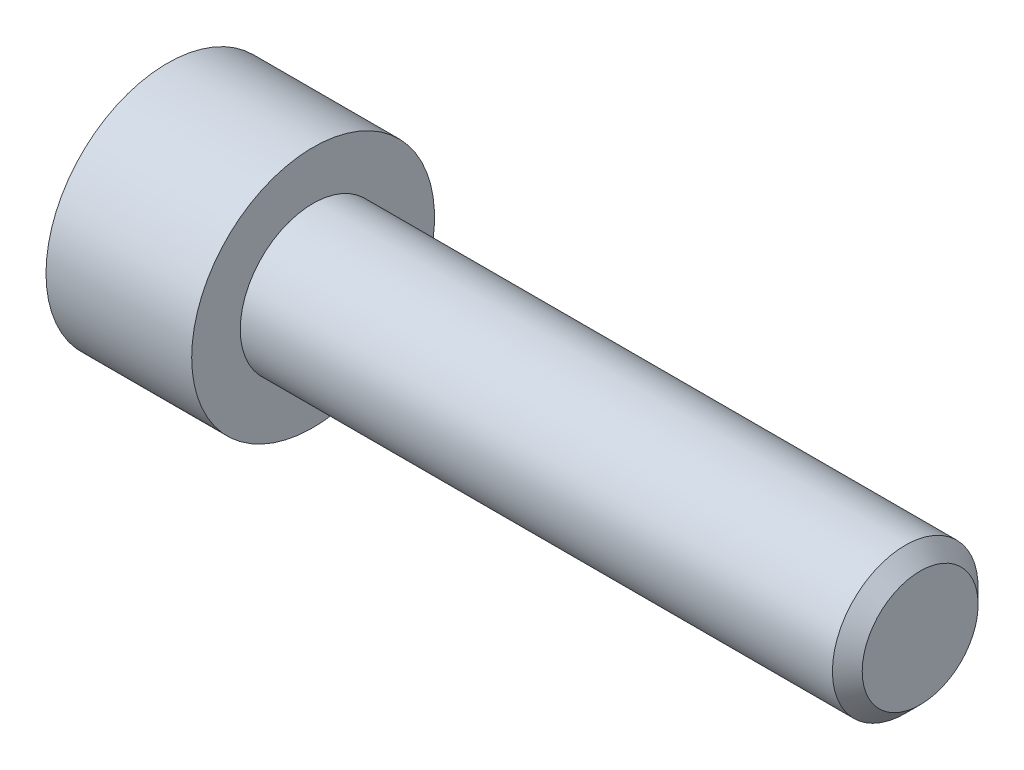
ISO-10303-21;
HEADER;
FILE_DESCRIPTION(('STEP AP214'),'2;1');
FILE_NAME('part.step','',(''),(''),'','','');
FILE_SCHEMA(('AUTOMOTIVE_DESIGN { 1 0 10303 214 1 1 1 1 }'));
ENDSEC;
DATA;
#1=APPLICATION_CONTEXT('core data for automotive mechanical design processes');
#2=APPLICATION_PROTOCOL_DEFINITION('international standard','automotive_design',2000,#1);
#3=PRODUCT_CONTEXT('',#1,'mechanical');
#4=PRODUCT('Part','Part','',(#3));
#5=PRODUCT_RELATED_PRODUCT_CATEGORY('part','',(#4));
#6=PRODUCT_DEFINITION_FORMATION('','',#4);
#7=PRODUCT_DEFINITION_CONTEXT('part definition',#1,'design');
#8=PRODUCT_DEFINITION('design','',#6,#7);
#9=PRODUCT_DEFINITION_SHAPE('','',#8);
#10=(LENGTH_UNIT() NAMED_UNIT(*) SI_UNIT(.MILLI.,.METRE.));
#11=(NAMED_UNIT(*) PLANE_ANGLE_UNIT() SI_UNIT($,.RADIAN.));
#12=(NAMED_UNIT(*) SI_UNIT($,.STERADIAN.) SOLID_ANGLE_UNIT());
#13=UNCERTAINTY_MEASURE_WITH_UNIT(LENGTH_MEASURE(1.E-05),#10,'distance_accuracy_value','');
#14=(GEOMETRIC_REPRESENTATION_CONTEXT(3) GLOBAL_UNCERTAINTY_ASSIGNED_CONTEXT((#13)) GLOBAL_UNIT_ASSIGNED_CONTEXT((#10,
#11,#12)) REPRESENTATION_CONTEXT('',''));
#15=CARTESIAN_POINT('',(0.,0.,0.));
#16=DIRECTION('',(0.,0.,1.));
#17=DIRECTION('',(1.,0.,0.));
#18=AXIS2_PLACEMENT_3D('',#15,#16,#17);
#19=CARTESIAN_POINT('',(4.,0.,0.));
#20=DIRECTION('',(1.,0.,0.));
#21=DIRECTION('',(0.,0.,-1.));
#22=AXIS2_PLACEMENT_3D('',#19,#20,#21);
#23=PLANE('',#22);
#24=DIRECTION('',(0.,1.,0.));
#25=VECTOR('',#24,1.);
#26=CARTESIAN_POINT('',(4.,0.,-2.5));
#27=LINE('',#26,#25);
#28=CARTESIAN_POINT('',(4.,-1.44337567297406,-2.5));
#29=VERTEX_POINT('',#28);
#30=CARTESIAN_POINT('',(3.99999999998113,0.,-2.49999999999886));
#31=VERTEX_POINT('',#30);
#32=EDGE_CURVE('E86',#29,#31,#27,.T.);
#33=ORIENTED_EDGE('',*,*,#32,.F.);
#34=DIRECTION('',(0.,0.500000000000004,-0.866025403784436));
#35=VECTOR('',#34,1.);
#36=CARTESIAN_POINT('',(4.,-2.1650635094611,-1.25));
#37=LINE('',#36,#35);
#38=CARTESIAN_POINT('',(3.99999999998113,-2.16506350946011,-1.24999999999943));
#39=VERTEX_POINT('',#38);
#40=EDGE_CURVE('E108',#39,#29,#37,.T.);
#41=ORIENTED_EDGE('',*,*,#40,.F.);
#42=CARTESIAN_POINT('',(3.99999999996226,0.,0.));
#43=DIRECTION('',(-1.,0.,0.));
#44=DIRECTION('',(0.,0.,1.));
#45=AXIS2_PLACEMENT_3D('',#42,#43,#44);
#46=CIRCLE('',#45,2.49999999999773);
#47=EDGE_CURVE('E19',#39,#31,#46,.F.);
#48=ORIENTED_EDGE('',*,*,#47,.T.);
#49=EDGE_LOOP('',(#33,#41,#48));
#50=FACE_BOUND('',#49,.T.);
#51=ADVANCED_FACE('F16',(#50),#23,.F.);
#52=CARTESIAN_POINT('',(4.,0.,0.));
#53=DIRECTION('',(1.,0.,0.));
#54=DIRECTION('',(0.,0.,-1.));
#55=AXIS2_PLACEMENT_3D('',#52,#53,#54);
#56=PLANE('',#55);
#57=DIRECTION('',(0.,0.500000000000004,0.866025403784436));
#58=VECTOR('',#57,1.);
#59=CARTESIAN_POINT('',(4.,1.44337567297406,-2.5));
#60=LINE('',#59,#58);
#61=CARTESIAN_POINT('',(4.,1.44337567297406,-2.5));
#62=VERTEX_POINT('',#61);
#63=CARTESIAN_POINT('',(3.99999999998113,2.16506350946011,-1.24999999999943));
#64=VERTEX_POINT('',#63);
#65=EDGE_CURVE('E128',#62,#64,#60,.T.);
#66=ORIENTED_EDGE('',*,*,#65,.F.);
#67=DIRECTION('',(0.,1.,0.));
#68=VECTOR('',#67,1.);
#69=CARTESIAN_POINT('',(4.,0.,-2.5));
#70=LINE('',#69,#68);
#71=EDGE_CURVE('E140',#31,#62,#70,.T.);
#72=ORIENTED_EDGE('',*,*,#71,.F.);
#73=CARTESIAN_POINT('',(3.99999999996226,0.,0.));
#74=DIRECTION('',(-1.,0.,0.));
#75=DIRECTION('',(0.,0.,1.));
#76=AXIS2_PLACEMENT_3D('',#73,#74,#75);
#77=CIRCLE('',#76,2.49999999999773);
#78=EDGE_CURVE('E119',#31,#64,#77,.F.);
#79=ORIENTED_EDGE('',*,*,#78,.T.);
#80=EDGE_LOOP('',(#66,#72,#79));
#81=FACE_BOUND('',#80,.T.);
#82=ADVANCED_FACE('F406',(#81),#56,.F.);
#83=CARTESIAN_POINT('',(4.,0.,0.));
#84=DIRECTION('',(1.,0.,0.));
#85=DIRECTION('',(0.,0.,-1.));
#86=AXIS2_PLACEMENT_3D('',#83,#84,#85);
#87=PLANE('',#86);
#88=DIRECTION('',(0.,-0.500000000000004,-0.866025403784436));
#89=VECTOR('',#88,1.);
#90=CARTESIAN_POINT('',(4.,-1.44337567297406,2.5));
#91=LINE('',#90,#89);
#92=CARTESIAN_POINT('',(4.,-1.44337567297406,2.5));
#93=VERTEX_POINT('',#92);
#94=CARTESIAN_POINT('',(3.99999999998113,-2.16506350946011,1.24999999999943));
#95=VERTEX_POINT('',#94);
#96=EDGE_CURVE('E120',#93,#95,#91,.T.);
#97=ORIENTED_EDGE('',*,*,#96,.F.);
#98=DIRECTION('',(0.,1.,0.));
#99=VECTOR('',#98,1.);
#100=CARTESIAN_POINT('',(4.,0.,2.5));
#101=LINE('',#100,#99);
#102=CARTESIAN_POINT('',(3.99999999998113,0.,2.49999999999886));
#103=VERTEX_POINT('',#102);
#104=EDGE_CURVE('E122',#103,#93,#101,.F.);
#105=ORIENTED_EDGE('',*,*,#104,.F.);
#106=CARTESIAN_POINT('',(3.99999999996226,0.,0.));
#107=DIRECTION('',(-1.,0.,0.));
#108=DIRECTION('',(0.,0.,1.));
#109=AXIS2_PLACEMENT_3D('',#106,#107,#108);
#110=CIRCLE('',#109,2.49999999999773);
#111=EDGE_CURVE('E102',#103,#95,#110,.F.);
#112=ORIENTED_EDGE('',*,*,#111,.T.);
#113=EDGE_LOOP('',(#97,#105,#112));
#114=FACE_BOUND('',#113,.T.);
#115=ADVANCED_FACE('F397',(#114),#87,.F.);
#116=CARTESIAN_POINT('',(3.99999999996226,0.,0.));
#117=DIRECTION('',(-1.,0.,0.));
#118=DIRECTION('',(0.,0.,1.));
#119=AXIS2_PLACEMENT_3D('',#116,#117,#118);
#120=CONICAL_SURFACE('',#119,2.49999999999773,1.0471975511585);
#121=CARTESIAN_POINT('',(3.99999999996226,0.,0.));
#122=DIRECTION('',(-1.,0.,0.));
#123=DIRECTION('',(0.,0.,1.));
#124=AXIS2_PLACEMENT_3D('',#121,#122,#123);
#125=CIRCLE('',#124,2.49999999999773);
#126=CARTESIAN_POINT('',(3.99999999998113,2.16506350946011,1.24999999999943));
#127=VERTEX_POINT('',#126);
#128=EDGE_CURVE('E121',#64,#127,#125,.F.);
#129=ORIENTED_EDGE('',*,*,#128,.F.);
#130=ORIENTED_EDGE('',*,*,#78,.F.);
#131=ORIENTED_EDGE('',*,*,#47,.F.);
#132=CARTESIAN_POINT('',(3.99999999996226,0.,0.));
#133=DIRECTION('',(-1.,0.,0.));
#134=DIRECTION('',(0.,0.,1.));
#135=AXIS2_PLACEMENT_3D('',#132,#133,#134);
#136=CIRCLE('',#135,2.49999999999773);
#137=EDGE_CURVE('E92',#95,#39,#136,.F.);
#138=ORIENTED_EDGE('',*,*,#137,.F.);
#139=ORIENTED_EDGE('',*,*,#111,.F.);
#140=CARTESIAN_POINT('',(3.99999999996226,0.,0.));
#141=DIRECTION('',(-1.,0.,0.));
#142=DIRECTION('',(0.,0.,1.));
#143=AXIS2_PLACEMENT_3D('',#140,#141,#142);
#144=CIRCLE('',#143,2.49999999999773);
#145=EDGE_CURVE('E101',#103,#127,#144,.T.);
#146=ORIENTED_EDGE('',*,*,#145,.T.);
#147=EDGE_LOOP('',(#129,#130,#131,#138,#139,#146));
#148=FACE_BOUND('',#147,.T.);
#149=CARTESIAN_POINT('',(5.44337567291109,5.6843418860808E-11,0.));
#150=VERTEX_POINT('',#149);
#151=VERTEX_LOOP('',#150);
#152=FACE_BOUND('',#151,.T.);
#153=ADVANCED_FACE('F116',(#148,#152),#120,.F.);
#154=CARTESIAN_POINT('',(4.,0.,0.));
#155=DIRECTION('',(1.,0.,0.));
#156=DIRECTION('',(0.,0.,-1.));
#157=AXIS2_PLACEMENT_3D('',#154,#155,#156);
#158=PLANE('',#157);
#159=DIRECTION('',(0.,1.,0.));
#160=VECTOR('',#159,1.);
#161=CARTESIAN_POINT('',(4.,-1.44337567297406,2.5));
#162=LINE('',#161,#160);
#163=CARTESIAN_POINT('',(4.,1.44337567297406,2.5));
#164=VERTEX_POINT('',#163);
#165=EDGE_CURVE('E192',#103,#164,#162,.T.);
#166=ORIENTED_EDGE('',*,*,#165,.T.);
#167=DIRECTION('',(0.,-0.5,0.866025403784439));
#168=VECTOR('',#167,1.);
#169=CARTESIAN_POINT('',(4.,1.44337567297406,2.5));
#170=LINE('',#169,#168);
#171=EDGE_CURVE('E190',#164,#127,#170,.F.);
#172=ORIENTED_EDGE('',*,*,#171,.T.);
#173=ORIENTED_EDGE('',*,*,#145,.F.);
#174=EDGE_LOOP('',(#166,#172,#173));
#175=FACE_BOUND('',#174,.T.);
#176=ADVANCED_FACE('F191',(#175),#158,.F.);
#177=CARTESIAN_POINT('',(4.,0.,0.));
#178=DIRECTION('',(1.,0.,0.));
#179=DIRECTION('',(0.,0.,-1.));
#180=AXIS2_PLACEMENT_3D('',#177,#178,#179);
#181=PLANE('',#180);
#182=ORIENTED_EDGE('',*,*,#137,.T.);
#183=DIRECTION('',(0.,0.5,-0.866025403784439));
#184=VECTOR('',#183,1.);
#185=CARTESIAN_POINT('',(4.,-1.44337567297406,-2.5));
#186=LINE('',#185,#184);
#187=CARTESIAN_POINT('',(4.,-2.88675134594813,0.));
#188=VERTEX_POINT('',#187);
#189=EDGE_CURVE('E95',#39,#188,#186,.F.);
#190=ORIENTED_EDGE('',*,*,#189,.T.);
#191=DIRECTION('',(0.,-0.5,-0.866025403784439));
#192=VECTOR('',#191,1.);
#193=CARTESIAN_POINT('',(4.,-2.88675134594813,0.));
#194=LINE('',#193,#192);
#195=EDGE_CURVE('E97',#188,#95,#194,.F.);
#196=ORIENTED_EDGE('',*,*,#195,.T.);
#197=EDGE_LOOP('',(#182,#190,#196));
#198=FACE_BOUND('',#197,.T.);
#199=ADVANCED_FACE('F94',(#198),#181,.F.);
#200=CARTESIAN_POINT('',(4.,0.,0.));
#201=DIRECTION('',(1.,0.,0.));
#202=DIRECTION('',(0.,0.,-1.));
#203=AXIS2_PLACEMENT_3D('',#200,#201,#202);
#204=PLANE('',#203);
#205=ORIENTED_EDGE('',*,*,#128,.T.);
#206=DIRECTION('',(0.,-0.5,0.866025403784439));
#207=VECTOR('',#206,1.);
#208=CARTESIAN_POINT('',(4.,1.44337567297406,2.5));
#209=LINE('',#208,#207);
#210=CARTESIAN_POINT('',(4.,2.88675134594813,0.));
#211=VERTEX_POINT('',#210);
#212=EDGE_CURVE('E175',#127,#211,#209,.F.);
#213=ORIENTED_EDGE('',*,*,#212,.T.);
#214=DIRECTION('',(0.,0.5,0.866025403784439));
#215=VECTOR('',#214,1.);
#216=CARTESIAN_POINT('',(4.,2.88675134594813,0.));
#217=LINE('',#216,#215);
#218=EDGE_CURVE('E184',#211,#64,#217,.F.);
#219=ORIENTED_EDGE('',*,*,#218,.T.);
#220=EDGE_LOOP('',(#205,#213,#219));
#221=FACE_BOUND('',#220,.T.);
#222=ADVANCED_FACE('F180',(#221),#204,.F.);
#223=CARTESIAN_POINT('',(0.,1.44337567297406,2.5));
#224=DIRECTION('',(0.,0.866025403784439,0.5));
#225=DIRECTION('',(0.,-0.5,0.866025403784439));
#226=AXIS2_PLACEMENT_3D('',#223,#224,#225);
#227=PLANE('',#226);
#228=DIRECTION('',(1.,0.,0.));
#229=VECTOR('',#228,1.);
#230=CARTESIAN_POINT('',(0.,1.44337567297406,2.5));
#231=LINE('',#230,#229);
#232=CARTESIAN_POINT('',(0.,1.44337567297406,2.5));
#233=VERTEX_POINT('',#232);
#234=EDGE_CURVE('E153',#164,#233,#231,.F.);
#235=ORIENTED_EDGE('',*,*,#234,.T.);
#236=DIRECTION('',(0.,-0.500000000000001,0.866025403784438));
#237=VECTOR('',#236,1.);
#238=CARTESIAN_POINT('',(0.,2.88675134594813,0.));
#239=LINE('',#238,#237);
#240=CARTESIAN_POINT('',(0.,2.88675134594813,0.));
#241=VERTEX_POINT('',#240);
#242=EDGE_CURVE('E205',#241,#233,#239,.T.);
#243=ORIENTED_EDGE('',*,*,#242,.F.);
#244=DIRECTION('',(1.,0.,0.));
#245=VECTOR('',#244,1.);
#246=CARTESIAN_POINT('',(0.,2.88675134594813,0.));
#247=LINE('',#246,#245);
#248=EDGE_CURVE('E157',#241,#211,#247,.T.);
#249=ORIENTED_EDGE('',*,*,#248,.T.);
#250=ORIENTED_EDGE('',*,*,#212,.F.);
#251=ORIENTED_EDGE('',*,*,#171,.F.);
#252=EDGE_LOOP('',(#235,#243,#249,#250,#251));
#253=FACE_BOUND('',#252,.T.);
#254=ADVANCED_FACE('F196',(#253),#227,.F.);
#255=CARTESIAN_POINT('',(0.,-1.44337567297406,2.5));
#256=DIRECTION('',(0.,0.,1.));
#257=DIRECTION('',(1.,0.,0.));
#258=AXIS2_PLACEMENT_3D('',#255,#256,#257);
#259=PLANE('',#258);
#260=DIRECTION('',(1.,0.,0.));
#261=VECTOR('',#260,1.);
#262=CARTESIAN_POINT('',(0.,-1.44337567297406,2.5));
#263=LINE('',#262,#261);
#264=CARTESIAN_POINT('',(0.,-1.44337567297406,2.5));
#265=VERTEX_POINT('',#264);
#266=EDGE_CURVE('E151',#93,#265,#263,.F.);
#267=ORIENTED_EDGE('',*,*,#266,.T.);
#268=DIRECTION('',(0.,1.,0.));
#269=VECTOR('',#268,1.);
#270=CARTESIAN_POINT('',(0.,2.5,2.5));
#271=LINE('',#270,#269);
#272=EDGE_CURVE('E208',#233,#265,#271,.F.);
#273=ORIENTED_EDGE('',*,*,#272,.F.);
#274=ORIENTED_EDGE('',*,*,#234,.F.);
#275=ORIENTED_EDGE('',*,*,#165,.F.);
#276=ORIENTED_EDGE('',*,*,#104,.T.);
#277=EDGE_LOOP('',(#267,#273,#274,#275,#276));
#278=FACE_BOUND('',#277,.T.);
#279=ADVANCED_FACE('F231',(#278),#259,.F.);
#280=CARTESIAN_POINT('',(0.,-2.88675134594813,0.));
#281=DIRECTION('',(0.,-0.866025403784439,0.5));
#282=DIRECTION('',(0.,-0.5,-0.866025403784439));
#283=AXIS2_PLACEMENT_3D('',#280,#281,#282);
#284=PLANE('',#283);
#285=DIRECTION('',(1.,0.,0.));
#286=VECTOR('',#285,1.);
#287=CARTESIAN_POINT('',(0.,-2.88675134594813,0.));
#288=LINE('',#287,#286);
#289=CARTESIAN_POINT('',(0.,-2.88675134594813,0.));
#290=VERTEX_POINT('',#289);
#291=EDGE_CURVE('E110',#188,#290,#288,.F.);
#292=ORIENTED_EDGE('',*,*,#291,.T.);
#293=DIRECTION('',(0.,-0.500000000000001,-0.866025403784438));
#294=VECTOR('',#293,1.);
#295=CARTESIAN_POINT('',(0.,-1.44337567297406,2.5));
#296=LINE('',#295,#294);
#297=EDGE_CURVE('E235',#265,#290,#296,.T.);
#298=ORIENTED_EDGE('',*,*,#297,.F.);
#299=ORIENTED_EDGE('',*,*,#266,.F.);
#300=ORIENTED_EDGE('',*,*,#96,.T.);
#301=ORIENTED_EDGE('',*,*,#195,.F.);
#302=EDGE_LOOP('',(#292,#298,#299,#300,#301));
#303=FACE_BOUND('',#302,.T.);
#304=ADVANCED_FACE('F340',(#303),#284,.F.);
#305=CARTESIAN_POINT('',(0.,-1.44337567297406,-2.5));
#306=DIRECTION('',(0.,-0.866025403784439,-0.5));
#307=DIRECTION('',(0.,0.5,-0.866025403784439));
#308=AXIS2_PLACEMENT_3D('',#305,#306,#307);
#309=PLANE('',#308);
#310=DIRECTION('',(-1.,0.,0.));
#311=VECTOR('',#310,1.);
#312=CARTESIAN_POINT('',(0.,-1.44337567297406,-2.5));
#313=LINE('',#312,#311);
#314=CARTESIAN_POINT('',(0.,-1.44337567297406,-2.5));
#315=VERTEX_POINT('',#314);
#316=EDGE_CURVE('E158',#29,#315,#313,.T.);
#317=ORIENTED_EDGE('',*,*,#316,.T.);
#318=DIRECTION('',(0.,0.500000000000001,-0.866025403784438));
#319=VECTOR('',#318,1.);
#320=CARTESIAN_POINT('',(0.,-2.88675134594813,0.));
#321=LINE('',#320,#319);
#322=EDGE_CURVE('E249',#290,#315,#321,.T.);
#323=ORIENTED_EDGE('',*,*,#322,.F.);
#324=ORIENTED_EDGE('',*,*,#291,.F.);
#325=ORIENTED_EDGE('',*,*,#189,.F.);
#326=ORIENTED_EDGE('',*,*,#40,.T.);
#327=EDGE_LOOP('',(#317,#323,#324,#325,#326));
#328=FACE_BOUND('',#327,.T.);
#329=ADVANCED_FACE('F107',(#328),#309,.F.);
#330=CARTESIAN_POINT('',(0.,1.44337567297406,-2.5));
#331=DIRECTION('',(0.,0.,-1.));
#332=DIRECTION('',(-1.,0.,0.));
#333=AXIS2_PLACEMENT_3D('',#330,#331,#332);
#334=PLANE('',#333);
#335=DIRECTION('',(1.,0.,0.));
#336=VECTOR('',#335,1.);
#337=CARTESIAN_POINT('',(0.,1.44337567297406,-2.5));
#338=LINE('',#337,#336);
#339=CARTESIAN_POINT('',(0.,1.44337567297406,-2.5));
#340=VERTEX_POINT('',#339);
#341=EDGE_CURVE('E34',#62,#340,#338,.F.);
#342=ORIENTED_EDGE('',*,*,#341,.T.);
#343=DIRECTION('',(0.,1.,0.));
#344=VECTOR('',#343,1.);
#345=CARTESIAN_POINT('',(0.,2.5,-2.5));
#346=LINE('',#345,#344);
#347=EDGE_CURVE('E213',#315,#340,#346,.T.);
#348=ORIENTED_EDGE('',*,*,#347,.F.);
#349=ORIENTED_EDGE('',*,*,#316,.F.);
#350=ORIENTED_EDGE('',*,*,#32,.T.);
#351=ORIENTED_EDGE('',*,*,#71,.T.);
#352=EDGE_LOOP('',(#342,#348,#349,#350,#351));
#353=FACE_BOUND('',#352,.T.);
#354=ADVANCED_FACE('F323',(#353),#334,.F.);
#355=CARTESIAN_POINT('',(0.,2.88675134594813,0.));
#356=DIRECTION('',(0.,0.866025403784439,-0.5));
#357=DIRECTION('',(0.,0.5,0.866025403784439));
#358=AXIS2_PLACEMENT_3D('',#355,#356,#357);
#359=PLANE('',#358);
#360=ORIENTED_EDGE('',*,*,#248,.F.);
#361=DIRECTION('',(0.,0.500000000000001,0.866025403784438));
#362=VECTOR('',#361,1.);
#363=CARTESIAN_POINT('',(0.,1.44337567297406,-2.5));
#364=LINE('',#363,#362);
#365=EDGE_CURVE('E173',#340,#241,#364,.T.);
#366=ORIENTED_EDGE('',*,*,#365,.F.);
#367=ORIENTED_EDGE('',*,*,#341,.F.);
#368=ORIENTED_EDGE('',*,*,#65,.T.);
#369=ORIENTED_EDGE('',*,*,#218,.F.);
#370=EDGE_LOOP('',(#360,#366,#367,#368,#369));
#371=FACE_BOUND('',#370,.T.);
#372=ADVANCED_FACE('F242',(#371),#359,.F.);
#373=CARTESIAN_POINT('',(0.,2.5,0.));
#374=DIRECTION('',(-1.,0.,0.));
#375=DIRECTION('',(0.,0.,1.));
#376=AXIS2_PLACEMENT_3D('',#373,#374,#375);
#377=PLANE('',#376);
#378=ORIENTED_EDGE('',*,*,#347,.T.);
#379=ORIENTED_EDGE('',*,*,#365,.T.);
#380=ORIENTED_EDGE('',*,*,#242,.T.);
#381=ORIENTED_EDGE('',*,*,#272,.T.);
#382=ORIENTED_EDGE('',*,*,#297,.T.);
#383=ORIENTED_EDGE('',*,*,#322,.T.);
#384=EDGE_LOOP('',(#378,#379,#380,#381,#382,#383));
#385=FACE_BOUND('',#384,.T.);
#386=CARTESIAN_POINT('',(0.,0.,0.));
#387=DIRECTION('',(-1.,0.,0.));
#388=DIRECTION('',(0.,0.,1.));
#389=AXIS2_PLACEMENT_3D('',#386,#387,#388);
#390=CIRCLE('',#389,5.);
#391=CARTESIAN_POINT('',(0.,0.,5.));
#392=VERTEX_POINT('',#391);
#393=EDGE_CURVE('E170',#392,#392,#390,.F.);
#394=ORIENTED_EDGE('',*,*,#393,.F.);
#395=EDGE_LOOP('',(#394));
#396=FACE_BOUND('',#395,.T.);
#397=ADVANCED_FACE('F238',(#385,#396),#377,.T.);
#398=CARTESIAN_POINT('',(31.,1.19325,0.));
#399=DIRECTION('',(1.,0.,0.));
#400=DIRECTION('',(0.,0.,-1.));
#401=AXIS2_PLACEMENT_3D('',#398,#399,#400);
#402=PLANE('',#401);
#403=CARTESIAN_POINT('',(30.9999999999491,0.,0.));
#404=DIRECTION('',(-1.,0.,0.));
#405=DIRECTION('',(0.,0.,1.));
#406=AXIS2_PLACEMENT_3D('',#403,#404,#405);
#407=CIRCLE('',#406,2.38650000000007);
#408=CARTESIAN_POINT('',(30.9999999999491,0.,2.38650000000007));
#409=VERTEX_POINT('',#408);
#410=EDGE_CURVE('E167',#409,#409,#407,.T.);
#411=ORIENTED_EDGE('',*,*,#410,.F.);
#412=EDGE_LOOP('',(#411));
#413=FACE_BOUND('',#412,.T.);
#414=ADVANCED_FACE('F271',(#413),#402,.T.);
#415=CARTESIAN_POINT('',(3.,0.,0.));
#416=DIRECTION('',(-1.,0.,0.));
#417=DIRECTION('',(0.,0.,1.));
#418=AXIS2_PLACEMENT_3D('',#415,#416,#417);
#419=CYLINDRICAL_SURFACE('',#418,5.);
#420=CARTESIAN_POINT('',(6.,0.,0.));
#421=DIRECTION('',(-1.,0.,0.));
#422=DIRECTION('',(0.,0.,1.));
#423=AXIS2_PLACEMENT_3D('',#420,#421,#422);
#424=CIRCLE('',#423,5.);
#425=CARTESIAN_POINT('',(6.,0.,5.));
#426=VERTEX_POINT('',#425);
#427=EDGE_CURVE('E164',#426,#426,#424,.F.);
#428=ORIENTED_EDGE('',*,*,#427,.F.);
#429=EDGE_LOOP('',(#428));
#430=FACE_BOUND('',#429,.T.);
#431=ORIENTED_EDGE('',*,*,#393,.T.);
#432=EDGE_LOOP('',(#431));
#433=FACE_BOUND('',#432,.T.);
#434=ADVANCED_FACE('F261',(#430,#433),#419,.T.);
#435=CARTESIAN_POINT('',(30.3865000000201,0.,0.));
#436=DIRECTION('',(-1.,0.,0.));
#437=DIRECTION('',(0.,0.,1.));
#438=AXIS2_PLACEMENT_3D('',#435,#436,#437);
#439=CONICAL_SURFACE('',#438,2.9999999999859,0.785398163443775);
#440=ORIENTED_EDGE('',*,*,#410,.T.);
#441=EDGE_LOOP('',(#440));
#442=FACE_BOUND('',#441,.T.);
#443=CARTESIAN_POINT('',(30.3865,0.,0.));
#444=DIRECTION('',(-1.,0.,0.));
#445=DIRECTION('',(0.,0.,1.));
#446=AXIS2_PLACEMENT_3D('',#443,#444,#445);
#447=CIRCLE('',#446,3.);
#448=CARTESIAN_POINT('',(30.3865,0.,3.));
#449=VERTEX_POINT('',#448);
#450=EDGE_CURVE('E25',#449,#449,#447,.T.);
#451=ORIENTED_EDGE('',*,*,#450,.F.);
#452=EDGE_LOOP('',(#451));
#453=FACE_BOUND('',#452,.T.);
#454=ADVANCED_FACE('F258',(#442,#453),#439,.T.);
#455=CARTESIAN_POINT('',(6.,4.,0.));
#456=DIRECTION('',(1.,0.,0.));
#457=DIRECTION('',(0.,0.,-1.));
#458=AXIS2_PLACEMENT_3D('',#455,#456,#457);
#459=PLANE('',#458);
#460=CARTESIAN_POINT('',(6.,0.,0.));
#461=DIRECTION('',(-1.,0.,0.));
#462=DIRECTION('',(0.,0.,1.));
#463=AXIS2_PLACEMENT_3D('',#460,#461,#462);
#464=CIRCLE('',#463,3.);
#465=CARTESIAN_POINT('',(6.,0.,3.));
#466=VERTEX_POINT('',#465);
#467=EDGE_CURVE('E11',#466,#466,#464,.F.);
#468=ORIENTED_EDGE('',*,*,#467,.F.);
#469=EDGE_LOOP('',(#468));
#470=FACE_BOUND('',#469,.T.);
#471=ORIENTED_EDGE('',*,*,#427,.T.);
#472=EDGE_LOOP('',(#471));
#473=FACE_BOUND('',#472,.T.);
#474=ADVANCED_FACE('F260',(#470,#473),#459,.T.);
#475=CARTESIAN_POINT('',(18.19325,0.,0.));
#476=DIRECTION('',(-1.,0.,0.));
#477=DIRECTION('',(0.,0.,1.));
#478=AXIS2_PLACEMENT_3D('',#475,#476,#477);
#479=CYLINDRICAL_SURFACE('',#478,3.);
#480=ORIENTED_EDGE('',*,*,#450,.T.);
#481=EDGE_LOOP('',(#480));
#482=FACE_BOUND('',#481,.T.);
#483=ORIENTED_EDGE('',*,*,#467,.T.);
#484=EDGE_LOOP('',(#483));
#485=FACE_BOUND('',#484,.T.);
#486=ADVANCED_FACE('F255',(#482,#485),#479,.T.);
#487=CLOSED_SHELL('',(#51,#82,#115,#153,#176,#199,#222,#254,#279,#304,#329,#354,#372,#397,#414,
#434,#454,#474,#486));
#488=MANIFOLD_SOLID_BREP('B1',#487);
#489=ADVANCED_BREP_SHAPE_REPRESENTATION('',(#18,#488),#14);
#490=SHAPE_DEFINITION_REPRESENTATION(#9,#489);
ENDSEC;
END-ISO-10303-21;
